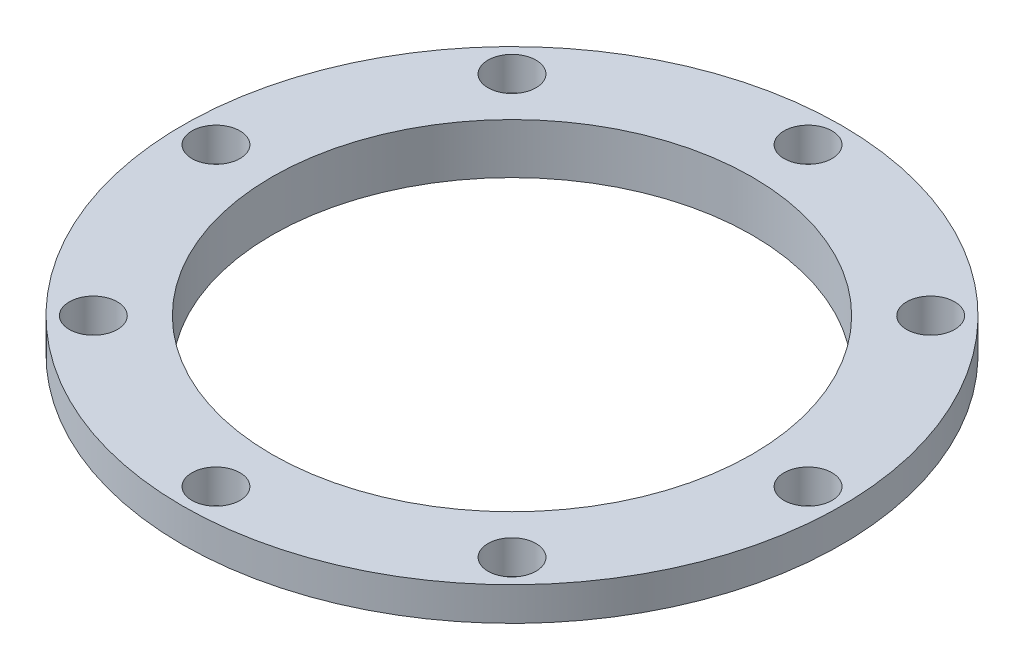
ISO-10303-21;
HEADER;
FILE_DESCRIPTION(('STEP AP214'),'2;1');
FILE_NAME('part.step','',(''),(''),'','','');
FILE_SCHEMA(('AUTOMOTIVE_DESIGN { 1 0 10303 214 1 1 1 1 }'));
ENDSEC;
DATA;
#1=APPLICATION_CONTEXT('core data for automotive mechanical design processes');
#2=APPLICATION_PROTOCOL_DEFINITION('international standard','automotive_design',2000,#1);
#3=PRODUCT_CONTEXT('',#1,'mechanical');
#4=PRODUCT('Part','Part','',(#3));
#5=PRODUCT_RELATED_PRODUCT_CATEGORY('part','',(#4));
#6=PRODUCT_DEFINITION_FORMATION('','',#4);
#7=PRODUCT_DEFINITION_CONTEXT('part definition',#1,'design');
#8=PRODUCT_DEFINITION('design','',#6,#7);
#9=PRODUCT_DEFINITION_SHAPE('','',#8);
#10=(LENGTH_UNIT() NAMED_UNIT(*) SI_UNIT(.MILLI.,.METRE.));
#11=(NAMED_UNIT(*) PLANE_ANGLE_UNIT() SI_UNIT($,.RADIAN.));
#12=(NAMED_UNIT(*) SI_UNIT($,.STERADIAN.) SOLID_ANGLE_UNIT());
#13=UNCERTAINTY_MEASURE_WITH_UNIT(LENGTH_MEASURE(1.E-05),#10,'distance_accuracy_value','');
#14=(GEOMETRIC_REPRESENTATION_CONTEXT(3) GLOBAL_UNCERTAINTY_ASSIGNED_CONTEXT((#13)) GLOBAL_UNIT_ASSIGNED_CONTEXT((#10,
#11,#12)) REPRESENTATION_CONTEXT('',''));
#15=CARTESIAN_POINT('',(0.,0.,0.));
#16=DIRECTION('',(0.,0.,1.));
#17=DIRECTION('',(1.,0.,0.));
#18=AXIS2_PLACEMENT_3D('',#15,#16,#17);
#19=CARTESIAN_POINT('',(0.,41.5,8.50000000000001));
#20=DIRECTION('',(0.,-1.,0.));
#21=DIRECTION('',(0.,0.,-1.));
#22=AXIS2_PLACEMENT_3D('',#19,#20,#21);
#23=PLANE('',#22);
#24=CARTESIAN_POINT('',(0.,41.5,3.50000000000001));
#25=DIRECTION('',(0.,1.,0.));
#26=DIRECTION('',(0.,0.,1.));
#27=AXIS2_PLACEMENT_3D('',#24,#25,#26);
#28=CIRCLE('',#27,2.15);
#29=CARTESIAN_POINT('',(0.,41.5,5.65000000000001));
#30=VERTEX_POINT('',#29);
#31=EDGE_CURVE('E161',#30,#30,#28,.T.);
#32=ORIENTED_EDGE('',*,*,#31,.F.);
#33=EDGE_LOOP('',(#32));
#34=FACE_BOUND('',#33,.T.);
#35=CARTESIAN_POINT('',(0.,41.5,30.));
#36=DIRECTION('',(0.,1.,0.));
#37=DIRECTION('',(0.,0.,1.));
#38=AXIS2_PLACEMENT_3D('',#35,#36,#37);
#39=CIRCLE('',#38,21.5);
#40=CARTESIAN_POINT('',(0.,41.5,51.5));
#41=VERTEX_POINT('',#40);
#42=EDGE_CURVE('E89',#41,#41,#39,.T.);
#43=ORIENTED_EDGE('',*,*,#42,.F.);
#44=EDGE_LOOP('',(#43));
#45=FACE_BOUND('',#44,.T.);
#46=CARTESIAN_POINT('',(0.,41.5,30.));
#47=DIRECTION('',(0.,1.,0.));
#48=DIRECTION('',(0.,0.,1.));
#49=AXIS2_PLACEMENT_3D('',#46,#47,#48);
#50=CIRCLE('',#49,29.5);
#51=CARTESIAN_POINT('',(0.,41.5,59.5));
#52=VERTEX_POINT('',#51);
#53=EDGE_CURVE('E93',#52,#52,#50,.T.);
#54=ORIENTED_EDGE('',*,*,#53,.T.);
#55=EDGE_LOOP('',(#54));
#56=FACE_BOUND('',#55,.T.);
#57=CARTESIAN_POINT('',(-18.7383297014433,41.5,11.2616702985562));
#58=DIRECTION('',(0.,1.,0.));
#59=DIRECTION('',(0.,0.,1.));
#60=AXIS2_PLACEMENT_3D('',#57,#58,#59);
#61=CIRCLE('',#60,2.15);
#62=CARTESIAN_POINT('',(-18.7383297014433,41.5,13.4116702985562));
#63=VERTEX_POINT('',#62);
#64=EDGE_CURVE('E105',#63,#63,#61,.T.);
#65=ORIENTED_EDGE('',*,*,#64,.F.);
#66=EDGE_LOOP('',(#65));
#67=FACE_BOUND('',#66,.T.);
#68=CARTESIAN_POINT('',(-26.5,41.5,29.9999999999997));
#69=DIRECTION('',(0.,1.,0.));
#70=DIRECTION('',(0.,0.,1.));
#71=AXIS2_PLACEMENT_3D('',#68,#69,#70);
#72=CIRCLE('',#71,2.15);
#73=CARTESIAN_POINT('',(-26.5,41.5,32.1499999999997));
#74=VERTEX_POINT('',#73);
#75=EDGE_CURVE('E113',#74,#74,#72,.T.);
#76=ORIENTED_EDGE('',*,*,#75,.F.);
#77=EDGE_LOOP('',(#76));
#78=FACE_BOUND('',#77,.T.);
#79=CARTESIAN_POINT('',(-18.7383297014437,41.5,48.7383297014433));
#80=DIRECTION('',(0.,1.,0.));
#81=DIRECTION('',(0.,0.,1.));
#82=AXIS2_PLACEMENT_3D('',#79,#80,#81);
#83=CIRCLE('',#82,2.15);
#84=CARTESIAN_POINT('',(-18.7383297014437,41.5,50.8883297014433));
#85=VERTEX_POINT('',#84);
#86=EDGE_CURVE('E121',#85,#85,#83,.T.);
#87=ORIENTED_EDGE('',*,*,#86,.F.);
#88=EDGE_LOOP('',(#87));
#89=FACE_BOUND('',#88,.T.);
#90=CARTESIAN_POINT('',(-2.5232802625097E-13,41.5,56.5));
#91=DIRECTION('',(0.,1.,0.));
#92=DIRECTION('',(0.,0.,1.));
#93=AXIS2_PLACEMENT_3D('',#90,#91,#92);
#94=CIRCLE('',#93,2.15);
#95=CARTESIAN_POINT('',(-2.5232802625097E-13,41.5,58.65));
#96=VERTEX_POINT('',#95);
#97=EDGE_CURVE('E129',#96,#96,#94,.T.);
#98=ORIENTED_EDGE('',*,*,#97,.F.);
#99=EDGE_LOOP('',(#98));
#100=FACE_BOUND('',#99,.T.);
#101=CARTESIAN_POINT('',(18.7383297014433,41.5,48.7383297014436));
#102=DIRECTION('',(0.,1.,0.));
#103=DIRECTION('',(0.,0.,1.));
#104=AXIS2_PLACEMENT_3D('',#101,#102,#103);
#105=CIRCLE('',#104,2.15);
#106=CARTESIAN_POINT('',(18.7383297014433,41.5,50.8883297014436));
#107=VERTEX_POINT('',#106);
#108=EDGE_CURVE('E137',#107,#107,#105,.T.);
#109=ORIENTED_EDGE('',*,*,#108,.F.);
#110=EDGE_LOOP('',(#109));
#111=FACE_BOUND('',#110,.T.);
#112=CARTESIAN_POINT('',(26.5,41.5,30.0000000000001));
#113=DIRECTION('',(0.,1.,0.));
#114=DIRECTION('',(0.,0.,1.));
#115=AXIS2_PLACEMENT_3D('',#112,#113,#114);
#116=CIRCLE('',#115,2.15);
#117=CARTESIAN_POINT('',(26.5,41.5,32.1500000000001));
#118=VERTEX_POINT('',#117);
#119=EDGE_CURVE('E145',#118,#118,#116,.T.);
#120=ORIENTED_EDGE('',*,*,#119,.F.);
#121=EDGE_LOOP('',(#120));
#122=FACE_BOUND('',#121,.T.);
#123=CARTESIAN_POINT('',(18.7383297014435,41.5,11.2616702985565));
#124=DIRECTION('',(0.,1.,0.));
#125=DIRECTION('',(0.,0.,1.));
#126=AXIS2_PLACEMENT_3D('',#123,#124,#125);
#127=CIRCLE('',#126,2.15);
#128=CARTESIAN_POINT('',(18.7383297014435,41.5,13.4116702985565));
#129=VERTEX_POINT('',#128);
#130=EDGE_CURVE('E153',#129,#129,#127,.T.);
#131=ORIENTED_EDGE('',*,*,#130,.F.);
#132=EDGE_LOOP('',(#131));
#133=FACE_BOUND('',#132,.T.);
#134=ADVANCED_FACE('F63',(#34,#45,#56,#67,#78,#89,#100,#111,#122,#133),#23,.F.);
#135=CARTESIAN_POINT('',(0.,45.428835137319,30.));
#136=DIRECTION('',(0.,1.,0.));
#137=DIRECTION('',(0.,0.,1.));
#138=AXIS2_PLACEMENT_3D('',#135,#136,#137);
#139=CYLINDRICAL_SURFACE('',#138,23.5);
#140=CARTESIAN_POINT('',(0.,38.1,30.));
#141=DIRECTION('',(0.,1.,0.));
#142=DIRECTION('',(0.,0.,1.));
#143=AXIS2_PLACEMENT_3D('',#140,#141,#142);
#144=CIRCLE('',#143,23.5);
#145=CARTESIAN_POINT('',(0.,38.1,53.5));
#146=VERTEX_POINT('',#145);
#147=EDGE_CURVE('E12',#146,#146,#144,.F.);
#148=ORIENTED_EDGE('',*,*,#147,.T.);
#149=EDGE_LOOP('',(#148));
#150=FACE_BOUND('',#149,.T.);
#151=CARTESIAN_POINT('',(0.,37.,30.));
#152=DIRECTION('',(0.,1.,0.));
#153=DIRECTION('',(0.,0.,1.));
#154=AXIS2_PLACEMENT_3D('',#151,#152,#153);
#155=CIRCLE('',#154,23.5);
#156=CARTESIAN_POINT('',(0.,37.,53.5));
#157=VERTEX_POINT('',#156);
#158=EDGE_CURVE('E77',#157,#157,#155,.T.);
#159=ORIENTED_EDGE('',*,*,#158,.T.);
#160=EDGE_LOOP('',(#159));
#161=FACE_BOUND('',#160,.T.);
#162=ADVANCED_FACE('F171',(#150,#161),#139,.T.);
#163=CARTESIAN_POINT('',(0.,37.,6.50000000000001));
#164=DIRECTION('',(0.,1.,0.));
#165=DIRECTION('',(0.,0.,1.));
#166=AXIS2_PLACEMENT_3D('',#163,#164,#165);
#167=PLANE('',#166);
#168=ORIENTED_EDGE('',*,*,#158,.F.);
#169=EDGE_LOOP('',(#168));
#170=FACE_BOUND('',#169,.T.);
#171=CARTESIAN_POINT('',(0.,37.,30.));
#172=DIRECTION('',(0.,1.,0.));
#173=DIRECTION('',(0.,0.,1.));
#174=AXIS2_PLACEMENT_3D('',#171,#172,#173);
#175=CIRCLE('',#174,21.5);
#176=CARTESIAN_POINT('',(0.,37.,51.5));
#177=VERTEX_POINT('',#176);
#178=EDGE_CURVE('E83',#177,#177,#175,.T.);
#179=ORIENTED_EDGE('',*,*,#178,.T.);
#180=EDGE_LOOP('',(#179));
#181=FACE_BOUND('',#180,.T.);
#182=ADVANCED_FACE('F236',(#170,#181),#167,.F.);
#183=CARTESIAN_POINT('',(0.,45.428835137319,30.));
#184=DIRECTION('',(0.,1.,0.));
#185=DIRECTION('',(0.,0.,1.));
#186=AXIS2_PLACEMENT_3D('',#183,#184,#185);
#187=CYLINDRICAL_SURFACE('',#186,21.5);
#188=ORIENTED_EDGE('',*,*,#178,.F.);
#189=EDGE_LOOP('',(#188));
#190=FACE_BOUND('',#189,.T.);
#191=ORIENTED_EDGE('',*,*,#42,.T.);
#192=EDGE_LOOP('',(#191));
#193=FACE_BOUND('',#192,.T.);
#194=ADVANCED_FACE('F231',(#190,#193),#187,.F.);
#195=CARTESIAN_POINT('',(0.,45.428835137319,30.));
#196=DIRECTION('',(0.,1.,0.));
#197=DIRECTION('',(0.,0.,1.));
#198=AXIS2_PLACEMENT_3D('',#195,#196,#197);
#199=CYLINDRICAL_SURFACE('',#198,29.5);
#200=ORIENTED_EDGE('',*,*,#53,.F.);
#201=EDGE_LOOP('',(#200));
#202=FACE_BOUND('',#201,.T.);
#203=CARTESIAN_POINT('',(0.,38.5,30.));
#204=DIRECTION('',(0.,1.,0.));
#205=DIRECTION('',(0.,0.,1.));
#206=AXIS2_PLACEMENT_3D('',#203,#204,#205);
#207=CIRCLE('',#206,29.5);
#208=CARTESIAN_POINT('',(0.,38.5,59.5));
#209=VERTEX_POINT('',#208);
#210=EDGE_CURVE('E97',#209,#209,#207,.T.);
#211=ORIENTED_EDGE('',*,*,#210,.T.);
#212=EDGE_LOOP('',(#211));
#213=FACE_BOUND('',#212,.T.);
#214=ADVANCED_FACE('F229',(#202,#213),#199,.T.);
#215=CARTESIAN_POINT('',(0.,38.5,0.500000000000007));
#216=DIRECTION('',(0.,1.,0.));
#217=DIRECTION('',(0.,0.,1.));
#218=AXIS2_PLACEMENT_3D('',#215,#216,#217);
#219=PLANE('',#218);
#220=CARTESIAN_POINT('',(0.,38.5,30.));
#221=DIRECTION('',(0.,1.,0.));
#222=DIRECTION('',(0.,0.,1.));
#223=AXIS2_PLACEMENT_3D('',#220,#221,#222);
#224=CIRCLE('',#223,23.9);
#225=CARTESIAN_POINT('',(0.,38.5,53.9));
#226=VERTEX_POINT('',#225);
#227=EDGE_CURVE('E71',#226,#226,#224,.T.);
#228=ORIENTED_EDGE('',*,*,#227,.T.);
#229=EDGE_LOOP('',(#228));
#230=FACE_BOUND('',#229,.T.);
#231=CARTESIAN_POINT('',(0.,38.5,3.50000000000001));
#232=DIRECTION('',(0.,1.,0.));
#233=DIRECTION('',(0.,0.,1.));
#234=AXIS2_PLACEMENT_3D('',#231,#232,#233);
#235=CIRCLE('',#234,2.15);
#236=CARTESIAN_POINT('',(0.,38.5,5.65000000000001));
#237=VERTEX_POINT('',#236);
#238=EDGE_CURVE('E157',#237,#237,#235,.T.);
#239=ORIENTED_EDGE('',*,*,#238,.T.);
#240=EDGE_LOOP('',(#239));
#241=FACE_BOUND('',#240,.T.);
#242=CARTESIAN_POINT('',(18.7383297014435,38.5,11.2616702985565));
#243=DIRECTION('',(0.,1.,0.));
#244=DIRECTION('',(0.,0.,1.));
#245=AXIS2_PLACEMENT_3D('',#242,#243,#244);
#246=CIRCLE('',#245,2.15);
#247=CARTESIAN_POINT('',(18.7383297014435,38.5,13.4116702985565));
#248=VERTEX_POINT('',#247);
#249=EDGE_CURVE('E149',#248,#248,#246,.T.);
#250=ORIENTED_EDGE('',*,*,#249,.T.);
#251=EDGE_LOOP('',(#250));
#252=FACE_BOUND('',#251,.T.);
#253=CARTESIAN_POINT('',(26.5,38.5,30.0000000000001));
#254=DIRECTION('',(0.,1.,0.));
#255=DIRECTION('',(0.,0.,1.));
#256=AXIS2_PLACEMENT_3D('',#253,#254,#255);
#257=CIRCLE('',#256,2.15);
#258=CARTESIAN_POINT('',(26.5,38.5,32.1500000000001));
#259=VERTEX_POINT('',#258);
#260=EDGE_CURVE('E141',#259,#259,#257,.T.);
#261=ORIENTED_EDGE('',*,*,#260,.T.);
#262=EDGE_LOOP('',(#261));
#263=FACE_BOUND('',#262,.T.);
#264=CARTESIAN_POINT('',(18.7383297014433,38.5,48.7383297014436));
#265=DIRECTION('',(0.,1.,0.));
#266=DIRECTION('',(0.,0.,1.));
#267=AXIS2_PLACEMENT_3D('',#264,#265,#266);
#268=CIRCLE('',#267,2.15);
#269=CARTESIAN_POINT('',(18.7383297014433,38.5,50.8883297014436));
#270=VERTEX_POINT('',#269);
#271=EDGE_CURVE('E133',#270,#270,#268,.T.);
#272=ORIENTED_EDGE('',*,*,#271,.T.);
#273=EDGE_LOOP('',(#272));
#274=FACE_BOUND('',#273,.T.);
#275=CARTESIAN_POINT('',(-2.5232802625097E-13,38.5,56.5));
#276=DIRECTION('',(0.,1.,0.));
#277=DIRECTION('',(0.,0.,1.));
#278=AXIS2_PLACEMENT_3D('',#275,#276,#277);
#279=CIRCLE('',#278,2.15);
#280=CARTESIAN_POINT('',(-2.5232802625097E-13,38.5,58.65));
#281=VERTEX_POINT('',#280);
#282=EDGE_CURVE('E125',#281,#281,#279,.T.);
#283=ORIENTED_EDGE('',*,*,#282,.T.);
#284=EDGE_LOOP('',(#283));
#285=FACE_BOUND('',#284,.T.);
#286=CARTESIAN_POINT('',(-18.7383297014437,38.5,48.7383297014433));
#287=DIRECTION('',(0.,1.,0.));
#288=DIRECTION('',(0.,0.,1.));
#289=AXIS2_PLACEMENT_3D('',#286,#287,#288);
#290=CIRCLE('',#289,2.15);
#291=CARTESIAN_POINT('',(-18.7383297014437,38.5,50.8883297014433));
#292=VERTEX_POINT('',#291);
#293=EDGE_CURVE('E117',#292,#292,#290,.T.);
#294=ORIENTED_EDGE('',*,*,#293,.T.);
#295=EDGE_LOOP('',(#294));
#296=FACE_BOUND('',#295,.T.);
#297=CARTESIAN_POINT('',(-26.5,38.5,29.9999999999997));
#298=DIRECTION('',(0.,1.,0.));
#299=DIRECTION('',(0.,0.,1.));
#300=AXIS2_PLACEMENT_3D('',#297,#298,#299);
#301=CIRCLE('',#300,2.15);
#302=CARTESIAN_POINT('',(-26.5,38.5,32.1499999999997));
#303=VERTEX_POINT('',#302);
#304=EDGE_CURVE('E109',#303,#303,#301,.T.);
#305=ORIENTED_EDGE('',*,*,#304,.T.);
#306=EDGE_LOOP('',(#305));
#307=FACE_BOUND('',#306,.T.);
#308=CARTESIAN_POINT('',(-18.7383297014433,38.5,11.2616702985562));
#309=DIRECTION('',(0.,1.,0.));
#310=DIRECTION('',(0.,0.,1.));
#311=AXIS2_PLACEMENT_3D('',#308,#309,#310);
#312=CIRCLE('',#311,2.15);
#313=CARTESIAN_POINT('',(-18.7383297014433,38.5,13.4116702985562));
#314=VERTEX_POINT('',#313);
#315=EDGE_CURVE('E101',#314,#314,#312,.T.);
#316=ORIENTED_EDGE('',*,*,#315,.T.);
#317=EDGE_LOOP('',(#316));
#318=FACE_BOUND('',#317,.T.);
#319=ORIENTED_EDGE('',*,*,#210,.F.);
#320=EDGE_LOOP('',(#319));
#321=FACE_BOUND('',#320,.T.);
#322=ADVANCED_FACE('F225',(#230,#241,#252,#263,#274,#285,#296,#307,#318,#321),#219,.F.);
#323=CARTESIAN_POINT('',(-18.7383297014433,41.5,11.2616702985562));
#324=DIRECTION('',(0.,1.,0.));
#325=DIRECTION('',(0.,0.,1.));
#326=AXIS2_PLACEMENT_3D('',#323,#324,#325);
#327=CYLINDRICAL_SURFACE('',#326,2.15);
#328=ORIENTED_EDGE('',*,*,#315,.F.);
#329=EDGE_LOOP('',(#328));
#330=FACE_BOUND('',#329,.T.);
#331=ORIENTED_EDGE('',*,*,#64,.T.);
#332=EDGE_LOOP('',(#331));
#333=FACE_BOUND('',#332,.T.);
#334=ADVANCED_FACE('F221',(#330,#333),#327,.F.);
#335=CARTESIAN_POINT('',(-26.5,41.5,29.9999999999997));
#336=DIRECTION('',(0.,1.,0.));
#337=DIRECTION('',(0.,0.,1.));
#338=AXIS2_PLACEMENT_3D('',#335,#336,#337);
#339=CYLINDRICAL_SURFACE('',#338,2.15);
#340=ORIENTED_EDGE('',*,*,#304,.F.);
#341=EDGE_LOOP('',(#340));
#342=FACE_BOUND('',#341,.T.);
#343=ORIENTED_EDGE('',*,*,#75,.T.);
#344=EDGE_LOOP('',(#343));
#345=FACE_BOUND('',#344,.T.);
#346=ADVANCED_FACE('F217',(#342,#345),#339,.F.);
#347=CARTESIAN_POINT('',(-18.7383297014437,41.5,48.7383297014433));
#348=DIRECTION('',(0.,1.,0.));
#349=DIRECTION('',(0.,0.,1.));
#350=AXIS2_PLACEMENT_3D('',#347,#348,#349);
#351=CYLINDRICAL_SURFACE('',#350,2.15);
#352=ORIENTED_EDGE('',*,*,#293,.F.);
#353=EDGE_LOOP('',(#352));
#354=FACE_BOUND('',#353,.T.);
#355=ORIENTED_EDGE('',*,*,#86,.T.);
#356=EDGE_LOOP('',(#355));
#357=FACE_BOUND('',#356,.T.);
#358=ADVANCED_FACE('F213',(#354,#357),#351,.F.);
#359=CARTESIAN_POINT('',(-2.5232802625097E-13,41.5,56.5));
#360=DIRECTION('',(0.,1.,0.));
#361=DIRECTION('',(0.,0.,1.));
#362=AXIS2_PLACEMENT_3D('',#359,#360,#361);
#363=CYLINDRICAL_SURFACE('',#362,2.15);
#364=ORIENTED_EDGE('',*,*,#282,.F.);
#365=EDGE_LOOP('',(#364));
#366=FACE_BOUND('',#365,.T.);
#367=ORIENTED_EDGE('',*,*,#97,.T.);
#368=EDGE_LOOP('',(#367));
#369=FACE_BOUND('',#368,.T.);
#370=ADVANCED_FACE('F209',(#366,#369),#363,.F.);
#371=CARTESIAN_POINT('',(18.7383297014433,41.5,48.7383297014436));
#372=DIRECTION('',(0.,1.,0.));
#373=DIRECTION('',(0.,0.,1.));
#374=AXIS2_PLACEMENT_3D('',#371,#372,#373);
#375=CYLINDRICAL_SURFACE('',#374,2.15);
#376=ORIENTED_EDGE('',*,*,#271,.F.);
#377=EDGE_LOOP('',(#376));
#378=FACE_BOUND('',#377,.T.);
#379=ORIENTED_EDGE('',*,*,#108,.T.);
#380=EDGE_LOOP('',(#379));
#381=FACE_BOUND('',#380,.T.);
#382=ADVANCED_FACE('F202',(#378,#381),#375,.F.);
#383=CARTESIAN_POINT('',(26.5,41.5,30.0000000000001));
#384=DIRECTION('',(0.,1.,0.));
#385=DIRECTION('',(0.,0.,1.));
#386=AXIS2_PLACEMENT_3D('',#383,#384,#385);
#387=CYLINDRICAL_SURFACE('',#386,2.15);
#388=ORIENTED_EDGE('',*,*,#260,.F.);
#389=EDGE_LOOP('',(#388));
#390=FACE_BOUND('',#389,.T.);
#391=ORIENTED_EDGE('',*,*,#119,.T.);
#392=EDGE_LOOP('',(#391));
#393=FACE_BOUND('',#392,.T.);
#394=ADVANCED_FACE('F193',(#390,#393),#387,.F.);
#395=CARTESIAN_POINT('',(18.7383297014435,41.5,11.2616702985565));
#396=DIRECTION('',(0.,1.,0.));
#397=DIRECTION('',(0.,0.,1.));
#398=AXIS2_PLACEMENT_3D('',#395,#396,#397);
#399=CYLINDRICAL_SURFACE('',#398,2.15);
#400=ORIENTED_EDGE('',*,*,#249,.F.);
#401=EDGE_LOOP('',(#400));
#402=FACE_BOUND('',#401,.T.);
#403=ORIENTED_EDGE('',*,*,#130,.T.);
#404=EDGE_LOOP('',(#403));
#405=FACE_BOUND('',#404,.T.);
#406=ADVANCED_FACE('F191',(#402,#405),#399,.F.);
#407=CARTESIAN_POINT('',(0.,41.5,3.50000000000001));
#408=DIRECTION('',(0.,1.,0.));
#409=DIRECTION('',(0.,0.,1.));
#410=AXIS2_PLACEMENT_3D('',#407,#408,#409);
#411=CYLINDRICAL_SURFACE('',#410,2.15);
#412=ORIENTED_EDGE('',*,*,#238,.F.);
#413=EDGE_LOOP('',(#412));
#414=FACE_BOUND('',#413,.T.);
#415=ORIENTED_EDGE('',*,*,#31,.T.);
#416=EDGE_LOOP('',(#415));
#417=FACE_BOUND('',#416,.T.);
#418=ADVANCED_FACE('F167',(#414,#417),#411,.F.);
#419=CARTESIAN_POINT('',(0.,38.1,30.));
#420=DIRECTION('',(0.,1.,0.));
#421=DIRECTION('',(0.,0.,1.));
#422=AXIS2_PLACEMENT_3D('',#419,#420,#421);
#423=TOROIDAL_SURFACE('',#422,23.9,0.4);
#424=ORIENTED_EDGE('',*,*,#147,.F.);
#425=EDGE_LOOP('',(#424));
#426=FACE_BOUND('',#425,.T.);
#427=ORIENTED_EDGE('',*,*,#227,.F.);
#428=EDGE_LOOP('',(#427));
#429=FACE_BOUND('',#428,.T.);
#430=ADVANCED_FACE('F65',(#426,#429),#423,.F.);
#431=CLOSED_SHELL('',(#134,#162,#182,#194,#214,#322,#334,#346,#358,#370,#382,#394,#406,#418,#430));
#432=MANIFOLD_SOLID_BREP('B2',#431);
#433=ADVANCED_BREP_SHAPE_REPRESENTATION('',(#18,#432),#14);
#434=SHAPE_DEFINITION_REPRESENTATION(#9,#433);
ENDSEC;
END-ISO-10303-21;
